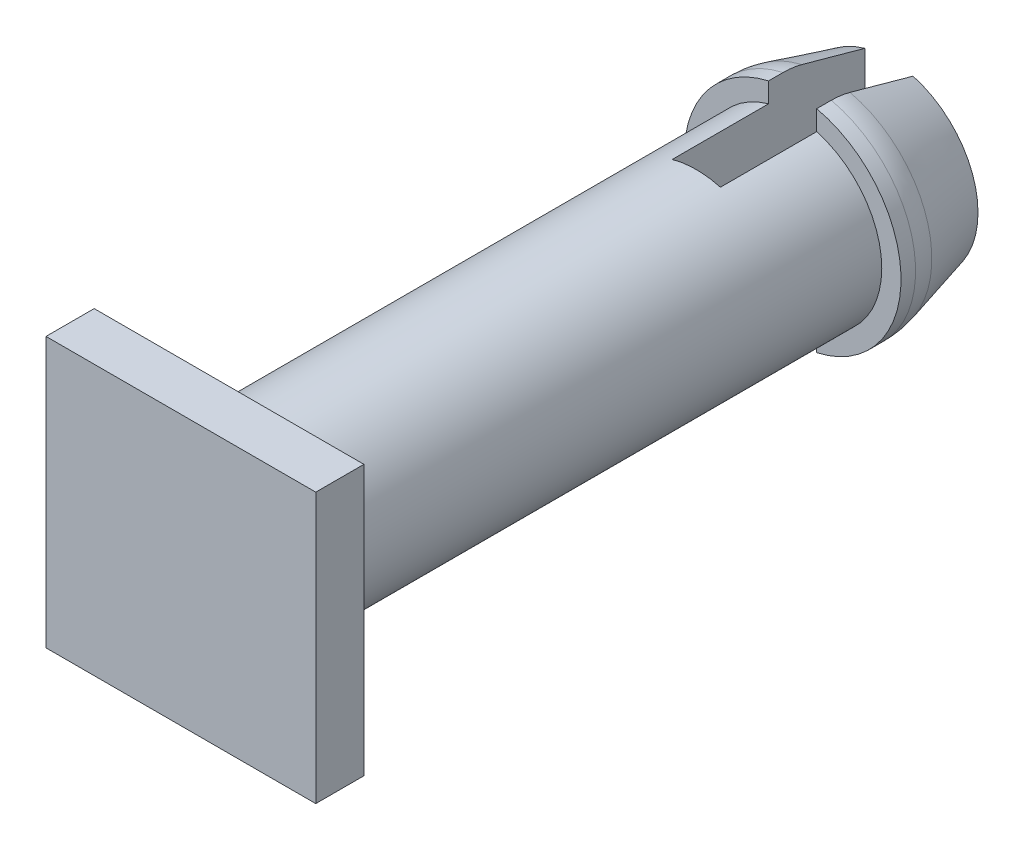
ISO-10303-21;
HEADER;
FILE_DESCRIPTION(('STEP AP214'),'2;1');
FILE_NAME('part.step','',(''),(''),'','','');
FILE_SCHEMA(('AUTOMOTIVE_DESIGN { 1 0 10303 214 1 1 1 1 }'));
ENDSEC;
DATA;
#1=APPLICATION_CONTEXT('core data for automotive mechanical design processes');
#2=APPLICATION_PROTOCOL_DEFINITION('international standard','automotive_design',2000,#1);
#3=PRODUCT_CONTEXT('',#1,'mechanical');
#4=PRODUCT('Part','Part','',(#3));
#5=PRODUCT_RELATED_PRODUCT_CATEGORY('part','',(#4));
#6=PRODUCT_DEFINITION_FORMATION('','',#4);
#7=PRODUCT_DEFINITION_CONTEXT('part definition',#1,'design');
#8=PRODUCT_DEFINITION('design','',#6,#7);
#9=PRODUCT_DEFINITION_SHAPE('','',#8);
#10=(LENGTH_UNIT() NAMED_UNIT(*) SI_UNIT(.MILLI.,.METRE.));
#11=(NAMED_UNIT(*) PLANE_ANGLE_UNIT() SI_UNIT($,.RADIAN.));
#12=(NAMED_UNIT(*) SI_UNIT($,.STERADIAN.) SOLID_ANGLE_UNIT());
#13=UNCERTAINTY_MEASURE_WITH_UNIT(LENGTH_MEASURE(1.E-05),#10,'distance_accuracy_value','');
#14=(GEOMETRIC_REPRESENTATION_CONTEXT(3) GLOBAL_UNCERTAINTY_ASSIGNED_CONTEXT((#13)) GLOBAL_UNIT_ASSIGNED_CONTEXT((#10,
#11,#12)) REPRESENTATION_CONTEXT('',''));
#15=CARTESIAN_POINT('',(0.,0.,0.));
#16=DIRECTION('',(0.,0.,1.));
#17=DIRECTION('',(1.,0.,0.));
#18=AXIS2_PLACEMENT_3D('',#15,#16,#17);
#19=CARTESIAN_POINT('',(0.,0.,-13.7));
#20=DIRECTION('',(0.,0.,-1.));
#21=DIRECTION('',(-1.,0.,0.));
#22=AXIS2_PLACEMENT_3D('',#19,#20,#21);
#23=PLANE('',#22);
#24=DIRECTION('',(0.,-1.,0.));
#25=VECTOR('',#24,1.);
#26=CARTESIAN_POINT('',(0.5,-2.64344159823514,-13.7));
#27=LINE('',#26,#25);
#28=CARTESIAN_POINT('',(0.5,1.77915308025196,-13.7));
#29=VERTEX_POINT('',#28);
#30=CARTESIAN_POINT('',(0.5,0.33166247903554,-13.7));
#31=VERTEX_POINT('',#30);
#32=EDGE_CURVE('E176',#29,#31,#27,.T.);
#33=ORIENTED_EDGE('',*,*,#32,.F.);
#34=CARTESIAN_POINT('',(0.,0.,-13.7));
#35=DIRECTION('',(0.,0.,-1.));
#36=DIRECTION('',(-1.,0.,0.));
#37=AXIS2_PLACEMENT_3D('',#34,#35,#36);
#38=CIRCLE('',#37,1.84807621135331);
#39=CARTESIAN_POINT('',(0.5,-1.77915308025196,-13.7));
#40=VERTEX_POINT('',#39);
#41=EDGE_CURVE('E189',#29,#40,#38,.T.);
#42=ORIENTED_EDGE('',*,*,#41,.T.);
#43=CARTESIAN_POINT('',(0.5,-0.33166247903554,-13.7));
#44=VERTEX_POINT('',#43);
#45=EDGE_CURVE('E193',#44,#40,#27,.T.);
#46=ORIENTED_EDGE('',*,*,#45,.F.);
#47=CARTESIAN_POINT('',(0.,0.,-13.7));
#48=DIRECTION('',(0.,0.,-1.));
#49=DIRECTION('',(-1.,0.,0.));
#50=AXIS2_PLACEMENT_3D('',#47,#48,#49);
#51=CIRCLE('',#50,0.6);
#52=EDGE_CURVE('E191',#31,#44,#51,.T.);
#53=ORIENTED_EDGE('',*,*,#52,.F.);
#54=EDGE_LOOP('',(#33,#42,#46,#53));
#55=FACE_BOUND('',#54,.T.);
#56=ADVANCED_FACE('F32',(#55),#23,.T.);
#57=CARTESIAN_POINT('',(0.,0.,-11.7));
#58=DIRECTION('',(0.,0.,-1.));
#59=DIRECTION('',(-1.,0.,0.));
#60=AXIS2_PLACEMENT_3D('',#57,#58,#59);
#61=PLANE('',#60);
#62=CARTESIAN_POINT('',(0.,0.,-11.7));
#63=DIRECTION('',(0.,0.,-1.));
#64=DIRECTION('',(-1.,0.,0.));
#65=AXIS2_PLACEMENT_3D('',#62,#63,#64);
#66=CIRCLE('',#65,2.25);
#67=CARTESIAN_POINT('',(0.5,2.19374109684803,-11.7));
#68=VERTEX_POINT('',#67);
#69=CARTESIAN_POINT('',(0.5,-2.19374109684803,-11.7));
#70=VERTEX_POINT('',#69);
#71=EDGE_CURVE('E309',#68,#70,#66,.T.);
#72=ORIENTED_EDGE('',*,*,#71,.F.);
#73=DIRECTION('',(0.,-1.,0.));
#74=VECTOR('',#73,1.);
#75=CARTESIAN_POINT('',(0.5,0.,-11.7));
#76=LINE('',#75,#74);
#77=CARTESIAN_POINT('',(0.5,1.78115131305569,-11.7));
#78=VERTEX_POINT('',#77);
#79=EDGE_CURVE('E278',#68,#78,#76,.T.);
#80=ORIENTED_EDGE('',*,*,#79,.T.);
#81=CARTESIAN_POINT('',(0.,0.,-11.7));
#82=DIRECTION('',(0.,0.,-1.));
#83=DIRECTION('',(-1.,0.,0.));
#84=AXIS2_PLACEMENT_3D('',#81,#82,#83);
#85=CIRCLE('',#84,1.85);
#86=CARTESIAN_POINT('',(0.5,-1.78115131305569,-11.7));
#87=VERTEX_POINT('',#86);
#88=EDGE_CURVE('E313',#87,#78,#85,.F.);
#89=ORIENTED_EDGE('',*,*,#88,.F.);
#90=EDGE_CURVE('E284',#87,#70,#76,.T.);
#91=ORIENTED_EDGE('',*,*,#90,.T.);
#92=EDGE_LOOP('',(#72,#80,#89,#91));
#93=FACE_BOUND('',#92,.T.);
#94=ADVANCED_FACE('F379',(#93),#61,.F.);
#95=CARTESIAN_POINT('',(0.,0.,-13.7));
#96=DIRECTION('',(0.,0.,1.));
#97=DIRECTION('',(1.,0.,0.));
#98=AXIS2_PLACEMENT_3D('',#95,#96,#97);
#99=CYLINDRICAL_SURFACE('',#98,2.25);
#100=DIRECTION('',(0.,0.,1.));
#101=VECTOR('',#100,1.);
#102=CARTESIAN_POINT('',(0.5,-2.19374109684803,-13.7));
#103=LINE('',#102,#101);
#104=CARTESIAN_POINT('',(0.5,-2.19374109684803,-12.0025212536189));
#105=VERTEX_POINT('',#104);
#106=EDGE_CURVE('E276',#70,#105,#103,.F.);
#107=ORIENTED_EDGE('',*,*,#106,.T.);
#108=CARTESIAN_POINT('',(0.,0.,-12.0025212536189));
#109=DIRECTION('',(0.,0.,-1.));
#110=DIRECTION('',(-1.,0.,0.));
#111=AXIS2_PLACEMENT_3D('',#108,#109,#110);
#112=CIRCLE('',#111,2.25);
#113=CARTESIAN_POINT('',(0.5,2.19374109684803,-12.0025212536189));
#114=VERTEX_POINT('',#113);
#115=EDGE_CURVE('E255',#105,#114,#112,.F.);
#116=ORIENTED_EDGE('',*,*,#115,.T.);
#117=DIRECTION('',(0.,0.,1.));
#118=VECTOR('',#117,1.);
#119=CARTESIAN_POINT('',(0.5,2.19374109684803,-13.7));
#120=LINE('',#119,#118);
#121=EDGE_CURVE('E274',#114,#68,#120,.T.);
#122=ORIENTED_EDGE('',*,*,#121,.T.);
#123=ORIENTED_EDGE('',*,*,#71,.T.);
#124=EDGE_LOOP('',(#107,#116,#122,#123));
#125=FACE_BOUND('',#124,.T.);
#126=ADVANCED_FACE('F272',(#125),#99,.T.);
#127=CARTESIAN_POINT('',(0.,0.,-13.7));
#128=DIRECTION('',(0.,0.,1.));
#129=DIRECTION('',(1.,0.,0.));
#130=AXIS2_PLACEMENT_3D('',#127,#128,#129);
#131=CONICAL_SURFACE('',#130,1.84807621135331,0.261799387799147);
#132=CARTESIAN_POINT('',(0.5,2.68310947778136,-10.4112294291725));
#133=CARTESIAN_POINT('',(0.5,2.61573901862016,-10.6584022854342));
#134=CARTESIAN_POINT('',(0.5,2.54829120453302,-10.9055540069983));
#135=CARTESIAN_POINT('',(0.5,2.41319371484635,-11.3998025978159));
#136=CARTESIAN_POINT('',(0.5,2.34554403899517,-11.6468994670005));
#137=CARTESIAN_POINT('',(0.5,2.14222491092982,-12.3880764499368));
#138=CARTESIAN_POINT('',(0.5,2.00618221392779,-12.8820544923279));
#139=CARTESIAN_POINT('',(0.5,1.80075669206068,-13.6226520648637));
#140=CARTESIAN_POINT('',(0.5,1.73205357660636,-13.8694599972735));
#141=CARTESIAN_POINT('',(0.5,1.59399408731313,-14.3628919356285));
#142=CARTESIAN_POINT('',(0.5,1.52463771666911,-14.6095159424668));
#143=CARTESIAN_POINT('',(0.5,1.38496271980328,-15.102498891586));
#144=CARTESIAN_POINT('',(0.5,1.31464406936458,-15.3488578270271));
#145=CARTESIAN_POINT('',(0.5,1.20801682084292,-15.7180669085807));
#146=CARTESIAN_POINT('',(0.5,1.17228256471222,-15.8410827118683));
#147=CARTESIAN_POINT('',(0.5,1.10029819822897,-16.0869640504111));
#148=CARTESIAN_POINT('',(0.5,1.06404808457415,-16.209829584699));
#149=CARTESIAN_POINT('',(0.5,1.02747379822656,-16.3325992836863));
#150=B_SPLINE_CURVE_WITH_KNOTS('',3,(#132,#133,#134,#135,#136,#137,#138,#139,#140,#141,#142,
#143,#144,#145,#146,#147,#148,#149),.UNSPECIFIED.,.F.,.F.,(4,2,2,2,2,2,2,2,4),(0.,
0.768569187561272,1.53713933364492,3.07424370539705,3.84281868329404,4.61138990425608,
5.37998050291097,5.76428203596207,6.1485860302313),.UNSPECIFIED.);
#151=CARTESIAN_POINT('',(0.5,2.14128739042845,-12.3907498212727));
#152=VERTEX_POINT('',#151);
#153=EDGE_CURVE('E172',#152,#29,#150,.T.);
#154=ORIENTED_EDGE('',*,*,#153,.F.);
#155=CARTESIAN_POINT('',(0.,0.,-12.3907498212727));
#156=DIRECTION('',(0.,0.,1.));
#157=DIRECTION('',(1.,0.,0.));
#158=AXIS2_PLACEMENT_3D('',#155,#156,#157);
#159=CIRCLE('',#158,2.1988887394336);
#160=CARTESIAN_POINT('',(0.5,-2.14128739042847,-12.3907498212726));
#161=VERTEX_POINT('',#160);
#162=EDGE_CURVE('E244',#152,#161,#159,.F.);
#163=ORIENTED_EDGE('',*,*,#162,.T.);
#164=CARTESIAN_POINT('',(0.5,-1.02747379822656,-16.3325992836863));
#165=CARTESIAN_POINT('',(0.5,-1.07066369732428,-16.1875953403458));
#166=CARTESIAN_POINT('',(0.5,-1.11341229811123,-16.0424611379748));
#167=CARTESIAN_POINT('',(0.5,-1.19822297700708,-15.7519934102126));
#168=CARTESIAN_POINT('',(0.5,-1.24028506075863,-15.6066598864704));
#169=CARTESIAN_POINT('',(0.5,-1.32391864337396,-15.3158552450658));
#170=CARTESIAN_POINT('',(0.5,-1.36549015207567,-15.170384130226));
#171=CARTESIAN_POINT('',(0.5,-1.44825584254114,-14.8793343057072));
#172=CARTESIAN_POINT('',(0.5,-1.48945002348095,-14.7337555957939));
#173=CARTESIAN_POINT('',(0.5,-1.58741909530588,-14.3862078265715));
#174=CARTESIAN_POINT('',(0.5,-1.64405933719465,-14.1842008322944));
#175=CARTESIAN_POINT('',(0.5,-1.75692815365878,-13.7800703916103));
#176=CARTESIAN_POINT('',(0.5,-1.81315672521137,-13.5779469443599));
#177=CARTESIAN_POINT('',(0.5,-2.00618570284141,-12.8820435578582));
#178=CARTESIAN_POINT('',(0.5,-2.14223111431006,-12.3880542614155));
#179=CARTESIAN_POINT('',(0.5,-2.3455516091372,-11.6468716600612));
#180=CARTESIAN_POINT('',(0.5,-2.41319977645981,-11.3997803555807));
#181=CARTESIAN_POINT('',(0.5,-2.54829425934912,-10.9055428969499));
#182=CARTESIAN_POINT('',(0.5,-2.61574057516743,-10.6583967428683));
#183=CARTESIAN_POINT('',(0.5,-2.68310947778136,-10.4112294291725));
#184=B_SPLINE_CURVE_WITH_KNOTS('',3,(#164,#165,#166,#167,#168,#169,#170,#171,#172,#173,#174,
#175,#176,#177,#178,#179,#180,#181,#182,#183),.UNSPECIFIED.,.F.,.F.,(4,2,2,2,2,2,2,2,2,4),(0.,
0.453895904983383,0.907788077404189,1.36167113201061,1.81555517749334,2.44494669826833,
3.07434283586032,4.61148178341834,5.38003464154219,6.14858654123284),.UNSPECIFIED.);
#185=EDGE_CURVE('E182',#40,#161,#184,.T.);
#186=ORIENTED_EDGE('',*,*,#185,.F.);
#187=ORIENTED_EDGE('',*,*,#41,.F.);
#188=EDGE_LOOP('',(#154,#163,#186,#187));
#189=FACE_BOUND('',#188,.T.);
#190=ADVANCED_FACE('F196',(#189),#131,.T.);
#191=CARTESIAN_POINT('',(-2.8,2.8,1.));
#192=DIRECTION('',(0.,1.,0.));
#193=DIRECTION('',(0.,0.,1.));
#194=AXIS2_PLACEMENT_3D('',#191,#192,#193);
#195=PLANE('',#194);
#196=DIRECTION('',(1.,0.,0.));
#197=VECTOR('',#196,1.);
#198=CARTESIAN_POINT('',(-2.8,2.8,0.));
#199=LINE('',#198,#197);
#200=CARTESIAN_POINT('',(-2.8,2.8,0.));
#201=VERTEX_POINT('',#200);
#202=CARTESIAN_POINT('',(2.8,2.8,0.));
#203=VERTEX_POINT('',#202);
#204=EDGE_CURVE('E317',#201,#203,#199,.T.);
#205=ORIENTED_EDGE('',*,*,#204,.F.);
#206=DIRECTION('',(0.,0.,-1.));
#207=VECTOR('',#206,1.);
#208=CARTESIAN_POINT('',(-2.8,2.8,1.));
#209=LINE('',#208,#207);
#210=CARTESIAN_POINT('',(-2.8,2.8,1.));
#211=VERTEX_POINT('',#210);
#212=EDGE_CURVE('E339',#211,#201,#209,.T.);
#213=ORIENTED_EDGE('',*,*,#212,.F.);
#214=DIRECTION('',(1.,0.,0.));
#215=VECTOR('',#214,1.);
#216=CARTESIAN_POINT('',(-2.8,2.8,1.));
#217=LINE('',#216,#215);
#218=CARTESIAN_POINT('',(2.8,2.8,1.));
#219=VERTEX_POINT('',#218);
#220=EDGE_CURVE('E318',#211,#219,#217,.T.);
#221=ORIENTED_EDGE('',*,*,#220,.T.);
#222=DIRECTION('',(0.,0.,-1.));
#223=VECTOR('',#222,1.);
#224=CARTESIAN_POINT('',(2.8,2.8,1.));
#225=LINE('',#224,#223);
#226=EDGE_CURVE('E329',#219,#203,#225,.T.);
#227=ORIENTED_EDGE('',*,*,#226,.T.);
#228=EDGE_LOOP('',(#205,#213,#221,#227));
#229=FACE_BOUND('',#228,.T.);
#230=ADVANCED_FACE('F348',(#229),#195,.T.);
#231=CARTESIAN_POINT('',(-2.8,2.8,1.));
#232=DIRECTION('',(1.,0.,0.));
#233=DIRECTION('',(0.,1.,0.));
#234=AXIS2_PLACEMENT_3D('',#231,#232,#233);
#235=PLANE('',#234);
#236=DIRECTION('',(0.,-1.,0.));
#237=VECTOR('',#236,1.);
#238=CARTESIAN_POINT('',(-2.8,2.8,0.));
#239=LINE('',#238,#237);
#240=CARTESIAN_POINT('',(-2.8,-2.8,0.));
#241=VERTEX_POINT('',#240);
#242=EDGE_CURVE('E322',#201,#241,#239,.T.);
#243=ORIENTED_EDGE('',*,*,#242,.T.);
#244=DIRECTION('',(0.,0.,-1.));
#245=VECTOR('',#244,1.);
#246=CARTESIAN_POINT('',(-2.8,-2.8,1.));
#247=LINE('',#246,#245);
#248=CARTESIAN_POINT('',(-2.8,-2.8,1.));
#249=VERTEX_POINT('',#248);
#250=EDGE_CURVE('E341',#249,#241,#247,.T.);
#251=ORIENTED_EDGE('',*,*,#250,.F.);
#252=DIRECTION('',(0.,-1.,0.));
#253=VECTOR('',#252,1.);
#254=CARTESIAN_POINT('',(-2.8,2.8,1.));
#255=LINE('',#254,#253);
#256=EDGE_CURVE('E327',#211,#249,#255,.T.);
#257=ORIENTED_EDGE('',*,*,#256,.F.);
#258=ORIENTED_EDGE('',*,*,#212,.T.);
#259=EDGE_LOOP('',(#243,#251,#257,#258));
#260=FACE_BOUND('',#259,.T.);
#261=ADVANCED_FACE('F360',(#260),#235,.F.);
#262=CARTESIAN_POINT('',(-2.8,-2.8,1.));
#263=DIRECTION('',(0.,1.,0.));
#264=DIRECTION('',(0.,0.,1.));
#265=AXIS2_PLACEMENT_3D('',#262,#263,#264);
#266=PLANE('',#265);
#267=DIRECTION('',(1.,0.,0.));
#268=VECTOR('',#267,1.);
#269=CARTESIAN_POINT('',(-2.8,-2.8,0.));
#270=LINE('',#269,#268);
#271=CARTESIAN_POINT('',(2.8,-2.8,0.));
#272=VERTEX_POINT('',#271);
#273=EDGE_CURVE('E335',#241,#272,#270,.T.);
#274=ORIENTED_EDGE('',*,*,#273,.T.);
#275=DIRECTION('',(0.,0.,-1.));
#276=VECTOR('',#275,1.);
#277=CARTESIAN_POINT('',(2.8,-2.8,1.));
#278=LINE('',#277,#276);
#279=CARTESIAN_POINT('',(2.8,-2.8,1.));
#280=VERTEX_POINT('',#279);
#281=EDGE_CURVE('E344',#280,#272,#278,.T.);
#282=ORIENTED_EDGE('',*,*,#281,.F.);
#283=DIRECTION('',(1.,0.,0.));
#284=VECTOR('',#283,1.);
#285=CARTESIAN_POINT('',(-2.8,-2.8,1.));
#286=LINE('',#285,#284);
#287=EDGE_CURVE('E325',#249,#280,#286,.T.);
#288=ORIENTED_EDGE('',*,*,#287,.F.);
#289=ORIENTED_EDGE('',*,*,#250,.T.);
#290=EDGE_LOOP('',(#274,#282,#288,#289));
#291=FACE_BOUND('',#290,.T.);
#292=ADVANCED_FACE('F364',(#291),#266,.F.);
#293=CARTESIAN_POINT('',(2.8,2.8,1.));
#294=DIRECTION('',(1.,0.,0.));
#295=DIRECTION('',(0.,1.,0.));
#296=AXIS2_PLACEMENT_3D('',#293,#294,#295);
#297=PLANE('',#296);
#298=DIRECTION('',(0.,-1.,0.));
#299=VECTOR('',#298,1.);
#300=CARTESIAN_POINT('',(2.8,2.8,0.));
#301=LINE('',#300,#299);
#302=EDGE_CURVE('E332',#203,#272,#301,.T.);
#303=ORIENTED_EDGE('',*,*,#302,.F.);
#304=ORIENTED_EDGE('',*,*,#226,.F.);
#305=DIRECTION('',(0.,-1.,0.));
#306=VECTOR('',#305,1.);
#307=CARTESIAN_POINT('',(2.8,2.8,1.));
#308=LINE('',#307,#306);
#309=EDGE_CURVE('E321',#219,#280,#308,.T.);
#310=ORIENTED_EDGE('',*,*,#309,.T.);
#311=ORIENTED_EDGE('',*,*,#281,.T.);
#312=EDGE_LOOP('',(#303,#304,#310,#311));
#313=FACE_BOUND('',#312,.T.);
#314=ADVANCED_FACE('F352',(#313),#297,.T.);
#315=CARTESIAN_POINT('',(0.,0.,1.));
#316=DIRECTION('',(0.,0.,-1.));
#317=DIRECTION('',(-1.,0.,0.));
#318=AXIS2_PLACEMENT_3D('',#315,#316,#317);
#319=PLANE('',#318);
#320=ORIENTED_EDGE('',*,*,#220,.F.);
#321=ORIENTED_EDGE('',*,*,#256,.T.);
#322=ORIENTED_EDGE('',*,*,#287,.T.);
#323=ORIENTED_EDGE('',*,*,#309,.F.);
#324=EDGE_LOOP('',(#320,#321,#322,#323));
#325=FACE_BOUND('',#324,.T.);
#326=ADVANCED_FACE('F366',(#325),#319,.F.);
#327=CARTESIAN_POINT('',(0.,0.,0.));
#328=DIRECTION('',(0.,0.,-1.));
#329=DIRECTION('',(-1.,0.,0.));
#330=AXIS2_PLACEMENT_3D('',#327,#328,#329);
#331=PLANE('',#330);
#332=CARTESIAN_POINT('',(0.,0.,0.));
#333=DIRECTION('',(0.,0.,-1.));
#334=DIRECTION('',(-1.,0.,0.));
#335=AXIS2_PLACEMENT_3D('',#332,#333,#334);
#336=CIRCLE('',#335,1.85);
#337=CARTESIAN_POINT('',(-1.85,0.,0.));
#338=VERTEX_POINT('',#337);
#339=EDGE_CURVE('E203',#338,#338,#336,.T.);
#340=ORIENTED_EDGE('',*,*,#339,.F.);
#341=EDGE_LOOP('',(#340));
#342=FACE_BOUND('',#341,.T.);
#343=ORIENTED_EDGE('',*,*,#204,.T.);
#344=ORIENTED_EDGE('',*,*,#302,.T.);
#345=ORIENTED_EDGE('',*,*,#273,.F.);
#346=ORIENTED_EDGE('',*,*,#242,.F.);
#347=EDGE_LOOP('',(#343,#344,#345,#346));
#348=FACE_BOUND('',#347,.T.);
#349=ADVANCED_FACE('F357',(#342,#348),#331,.T.);
#350=CARTESIAN_POINT('',(0.,0.,-11.7));
#351=DIRECTION('',(0.,0.,1.));
#352=DIRECTION('',(1.,0.,0.));
#353=AXIS2_PLACEMENT_3D('',#350,#351,#352);
#354=CYLINDRICAL_SURFACE('',#353,1.85);
#355=DIRECTION('',(0.,0.,1.));
#356=VECTOR('',#355,1.);
#357=CARTESIAN_POINT('',(0.5,-1.78115131305569,-11.7));
#358=LINE('',#357,#356);
#359=CARTESIAN_POINT('',(0.5,-1.78115131305569,-9.7));
#360=VERTEX_POINT('',#359);
#361=EDGE_CURVE('E292',#87,#360,#358,.T.);
#362=ORIENTED_EDGE('',*,*,#361,.F.);
#363=ORIENTED_EDGE('',*,*,#88,.T.);
#364=DIRECTION('',(0.,0.,1.));
#365=VECTOR('',#364,1.);
#366=CARTESIAN_POINT('',(0.5,1.78115131305569,-11.7));
#367=LINE('',#366,#365);
#368=CARTESIAN_POINT('',(0.5,1.78115131305569,-9.7));
#369=VERTEX_POINT('',#368);
#370=EDGE_CURVE('E282',#369,#78,#367,.F.);
#371=ORIENTED_EDGE('',*,*,#370,.F.);
#372=CARTESIAN_POINT('',(0.,0.,-9.7));
#373=DIRECTION('',(0.,0.,-1.));
#374=DIRECTION('',(-1.,0.,0.));
#375=AXIS2_PLACEMENT_3D('',#372,#373,#374);
#376=CIRCLE('',#375,1.85);
#377=CARTESIAN_POINT('',(-0.5,1.78115131305569,-9.7));
#378=VERTEX_POINT('',#377);
#379=EDGE_CURVE('E299',#369,#378,#376,.F.);
#380=ORIENTED_EDGE('',*,*,#379,.T.);
#381=DIRECTION('',(0.,0.,1.));
#382=VECTOR('',#381,1.);
#383=CARTESIAN_POINT('',(-0.5,1.78115131305569,-11.7));
#384=LINE('',#383,#382);
#385=CARTESIAN_POINT('',(-0.5,1.78115131305569,-11.7));
#386=VERTEX_POINT('',#385);
#387=EDGE_CURVE('E415',#386,#378,#384,.T.);
#388=ORIENTED_EDGE('',*,*,#387,.F.);
#389=CARTESIAN_POINT('',(-0.5,-1.78115131305569,-11.7));
#390=VERTEX_POINT('',#389);
#391=EDGE_CURVE('E310',#386,#390,#85,.F.);
#392=ORIENTED_EDGE('',*,*,#391,.T.);
#393=DIRECTION('',(0.,0.,1.));
#394=VECTOR('',#393,1.);
#395=CARTESIAN_POINT('',(-0.5,-1.78115131305569,-11.7));
#396=LINE('',#395,#394);
#397=CARTESIAN_POINT('',(-0.5,-1.78115131305569,-9.7));
#398=VERTEX_POINT('',#397);
#399=EDGE_CURVE('E417',#398,#390,#396,.F.);
#400=ORIENTED_EDGE('',*,*,#399,.F.);
#401=EDGE_CURVE('E302',#398,#360,#376,.F.);
#402=ORIENTED_EDGE('',*,*,#401,.T.);
#403=EDGE_LOOP('',(#362,#363,#371,#380,#388,#392,#400,#402));
#404=FACE_BOUND('',#403,.T.);
#405=ORIENTED_EDGE('',*,*,#339,.T.);
#406=EDGE_LOOP('',(#405));
#407=FACE_BOUND('',#406,.T.);
#408=ADVANCED_FACE('F373',(#404,#407),#354,.T.);
#409=DIRECTION('',(0.,1.,0.));
#410=VECTOR('',#409,1.);
#411=CARTESIAN_POINT('',(-0.5,-2.64344159823514,-13.7));
#412=LINE('',#411,#410);
#413=CARTESIAN_POINT('',(-0.5,-1.77915308025196,-13.7));
#414=VERTEX_POINT('',#413);
#415=CARTESIAN_POINT('',(-0.5,-0.33166247903554,-13.7));
#416=VERTEX_POINT('',#415);
#417=EDGE_CURVE('E398',#414,#416,#412,.T.);
#418=ORIENTED_EDGE('',*,*,#417,.F.);
#419=CARTESIAN_POINT('',(-0.5,1.77915308025196,-13.7));
#420=VERTEX_POINT('',#419);
#421=EDGE_CURVE('E199',#414,#420,#38,.T.);
#422=ORIENTED_EDGE('',*,*,#421,.T.);
#423=CARTESIAN_POINT('',(-0.5,0.33166247903554,-13.7));
#424=VERTEX_POINT('',#423);
#425=EDGE_CURVE('E192',#424,#420,#412,.T.);
#426=ORIENTED_EDGE('',*,*,#425,.F.);
#427=EDGE_CURVE('E303',#416,#424,#51,.T.);
#428=ORIENTED_EDGE('',*,*,#427,.F.);
#429=EDGE_LOOP('',(#418,#422,#426,#428));
#430=FACE_BOUND('',#429,.T.);
#431=ADVANCED_FACE('F380',(#430),#23,.T.);
#432=CARTESIAN_POINT('',(-0.5,-2.19374109684803,-11.7));
#433=VERTEX_POINT('',#432);
#434=CARTESIAN_POINT('',(-0.5,2.19374109684803,-11.7));
#435=VERTEX_POINT('',#434);
#436=EDGE_CURVE('E306',#433,#435,#66,.T.);
#437=ORIENTED_EDGE('',*,*,#436,.F.);
#438=DIRECTION('',(0.,1.,0.));
#439=VECTOR('',#438,1.);
#440=CARTESIAN_POINT('',(-0.5,0.,-11.7));
#441=LINE('',#440,#439);
#442=EDGE_CURVE('E413',#433,#390,#441,.T.);
#443=ORIENTED_EDGE('',*,*,#442,.T.);
#444=ORIENTED_EDGE('',*,*,#391,.F.);
#445=EDGE_CURVE('E419',#386,#435,#441,.T.);
#446=ORIENTED_EDGE('',*,*,#445,.T.);
#447=EDGE_LOOP('',(#437,#443,#444,#446));
#448=FACE_BOUND('',#447,.T.);
#449=ADVANCED_FACE('F386',(#448),#61,.F.);
#450=DIRECTION('',(0.,0.,1.));
#451=VECTOR('',#450,1.);
#452=CARTESIAN_POINT('',(-0.5,2.19374109684803,-13.7));
#453=LINE('',#452,#451);
#454=CARTESIAN_POINT('',(-0.5,2.19374109684803,-12.0025212536189));
#455=VERTEX_POINT('',#454);
#456=EDGE_CURVE('E411',#435,#455,#453,.F.);
#457=ORIENTED_EDGE('',*,*,#456,.T.);
#458=CARTESIAN_POINT('',(0.,0.,-12.0025212536189));
#459=DIRECTION('',(0.,0.,-1.));
#460=DIRECTION('',(-1.,0.,0.));
#461=AXIS2_PLACEMENT_3D('',#458,#459,#460);
#462=CIRCLE('',#461,2.25);
#463=CARTESIAN_POINT('',(-0.5,-2.19374109684803,-12.0025212536189));
#464=VERTEX_POINT('',#463);
#465=EDGE_CURVE('E236',#455,#464,#462,.F.);
#466=ORIENTED_EDGE('',*,*,#465,.T.);
#467=DIRECTION('',(0.,0.,1.));
#468=VECTOR('',#467,1.);
#469=CARTESIAN_POINT('',(-0.5,-2.19374109684803,-13.7));
#470=LINE('',#469,#468);
#471=EDGE_CURVE('E409',#464,#433,#470,.T.);
#472=ORIENTED_EDGE('',*,*,#471,.T.);
#473=ORIENTED_EDGE('',*,*,#436,.T.);
#474=EDGE_LOOP('',(#457,#466,#472,#473));
#475=FACE_BOUND('',#474,.T.);
#476=ADVANCED_FACE('F393',(#475),#99,.T.);
#477=CARTESIAN_POINT('',(0.,0.,-6.7));
#478=DIRECTION('',(0.,0.,-1.));
#479=DIRECTION('',(-1.,0.,0.));
#480=AXIS2_PLACEMENT_3D('',#477,#478,#479);
#481=PLANE('',#480);
#482=CARTESIAN_POINT('',(0.,0.,-6.7));
#483=DIRECTION('',(0.,0.,-1.));
#484=DIRECTION('',(-1.,0.,0.));
#485=AXIS2_PLACEMENT_3D('',#482,#483,#484);
#486=CIRCLE('',#485,0.6);
#487=CARTESIAN_POINT('',(-0.6,0.,-6.7));
#488=VERTEX_POINT('',#487);
#489=EDGE_CURVE('E314',#488,#488,#486,.T.);
#490=ORIENTED_EDGE('',*,*,#489,.T.);
#491=EDGE_LOOP('',(#490));
#492=FACE_BOUND('',#491,.T.);
#493=ADVANCED_FACE('F545',(#492),#481,.T.);
#494=CARTESIAN_POINT('',(0.,0.,-6.7));
#495=DIRECTION('',(0.,0.,-1.));
#496=DIRECTION('',(-1.,0.,0.));
#497=AXIS2_PLACEMENT_3D('',#494,#495,#496);
#498=CYLINDRICAL_SURFACE('',#497,0.6);
#499=ORIENTED_EDGE('',*,*,#52,.T.);
#500=DIRECTION('',(0.,0.,-1.));
#501=VECTOR('',#500,1.);
#502=CARTESIAN_POINT('',(0.5,-0.33166247903554,-6.7));
#503=LINE('',#502,#501);
#504=CARTESIAN_POINT('',(0.5,-0.33166247903554,-9.7));
#505=VERTEX_POINT('',#504);
#506=EDGE_CURVE('E296',#44,#505,#503,.F.);
#507=ORIENTED_EDGE('',*,*,#506,.T.);
#508=CARTESIAN_POINT('',(0.,0.,-9.7));
#509=DIRECTION('',(0.,0.,-1.));
#510=DIRECTION('',(-1.,0.,0.));
#511=AXIS2_PLACEMENT_3D('',#508,#509,#510);
#512=CIRCLE('',#511,0.6);
#513=CARTESIAN_POINT('',(-0.5,-0.33166247903554,-9.7));
#514=VERTEX_POINT('',#513);
#515=EDGE_CURVE('E258',#514,#505,#512,.F.);
#516=ORIENTED_EDGE('',*,*,#515,.F.);
#517=DIRECTION('',(0.,0.,-1.));
#518=VECTOR('',#517,1.);
#519=CARTESIAN_POINT('',(-0.5,-0.33166247903554,-6.7));
#520=LINE('',#519,#518);
#521=EDGE_CURVE('E286',#514,#416,#520,.T.);
#522=ORIENTED_EDGE('',*,*,#521,.T.);
#523=ORIENTED_EDGE('',*,*,#427,.T.);
#524=DIRECTION('',(0.,0.,-1.));
#525=VECTOR('',#524,1.);
#526=CARTESIAN_POINT('',(-0.5,0.33166247903554,-6.7));
#527=LINE('',#526,#525);
#528=CARTESIAN_POINT('',(-0.5,0.33166247903554,-9.7));
#529=VERTEX_POINT('',#528);
#530=EDGE_CURVE('E280',#424,#529,#527,.F.);
#531=ORIENTED_EDGE('',*,*,#530,.T.);
#532=CARTESIAN_POINT('',(0.5,0.33166247903554,-9.7));
#533=VERTEX_POINT('',#532);
#534=EDGE_CURVE('E259',#533,#529,#512,.F.);
#535=ORIENTED_EDGE('',*,*,#534,.F.);
#536=DIRECTION('',(0.,0.,-1.));
#537=VECTOR('',#536,1.);
#538=CARTESIAN_POINT('',(0.5,0.33166247903554,-6.7));
#539=LINE('',#538,#537);
#540=EDGE_CURVE('E294',#533,#31,#539,.T.);
#541=ORIENTED_EDGE('',*,*,#540,.T.);
#542=EDGE_LOOP('',(#499,#507,#516,#522,#523,#531,#535,#541));
#543=FACE_BOUND('',#542,.T.);
#544=ORIENTED_EDGE('',*,*,#489,.F.);
#545=EDGE_LOOP('',(#544));
#546=FACE_BOUND('',#545,.T.);
#547=ADVANCED_FACE('F424',(#543,#546),#498,.F.);
#548=CARTESIAN_POINT('',(-0.5,-2.68310947778136,-10.4112294291725));
#549=CARTESIAN_POINT('',(-0.5,-2.61573901862016,-10.6584022854342));
#550=CARTESIAN_POINT('',(-0.5,-2.54829120453302,-10.9055540069983));
#551=CARTESIAN_POINT('',(-0.5,-2.41319371484635,-11.3998025978159));
#552=CARTESIAN_POINT('',(-0.5,-2.34554403899517,-11.6468994670005));
#553=CARTESIAN_POINT('',(-0.5,-2.14222491092982,-12.3880764499368));
#554=CARTESIAN_POINT('',(-0.5,-2.00618221392779,-12.8820544923279));
#555=CARTESIAN_POINT('',(-0.5,-1.80075669206068,-13.6226520648637));
#556=CARTESIAN_POINT('',(-0.5,-1.73205357660636,-13.8694599972735));
#557=CARTESIAN_POINT('',(-0.5,-1.59399408731313,-14.3628919356285));
#558=CARTESIAN_POINT('',(-0.5,-1.52463771666911,-14.6095159424668));
#559=CARTESIAN_POINT('',(-0.5,-1.38496271980328,-15.102498891586));
#560=CARTESIAN_POINT('',(-0.5,-1.31464406936458,-15.3488578270271));
#561=CARTESIAN_POINT('',(-0.5,-1.20801682084292,-15.7180669085807));
#562=CARTESIAN_POINT('',(-0.5,-1.17228256471222,-15.8410827118683));
#563=CARTESIAN_POINT('',(-0.5,-1.10029819822897,-16.0869640504111));
#564=CARTESIAN_POINT('',(-0.5,-1.06404808457415,-16.209829584699));
#565=CARTESIAN_POINT('',(-0.5,-1.02747379822656,-16.3325992836863));
#566=B_SPLINE_CURVE_WITH_KNOTS('',3,(#548,#549,#550,#551,#552,#553,#554,#555,#556,#557,#558,
#559,#560,#561,#562,#563,#564,#565),.UNSPECIFIED.,.F.,.F.,(4,2,2,2,2,2,2,2,4),(0.,
0.768569187561272,1.53713933364492,3.07424370539705,3.84281868329404,4.61138990425608,
5.37998050291097,5.76428203596207,6.1485860302313),.UNSPECIFIED.);
#567=CARTESIAN_POINT('',(-0.5,-2.14128739042845,-12.3907498212727));
#568=VERTEX_POINT('',#567);
#569=EDGE_CURVE('E183',#568,#414,#566,.T.);
#570=ORIENTED_EDGE('',*,*,#569,.F.);
#571=CARTESIAN_POINT('',(0.,0.,-12.3907498212727));
#572=DIRECTION('',(0.,0.,1.));
#573=DIRECTION('',(1.,0.,0.));
#574=AXIS2_PLACEMENT_3D('',#571,#572,#573);
#575=CIRCLE('',#574,2.1988887394336);
#576=CARTESIAN_POINT('',(-0.5,2.14128739042847,-12.3907498212726));
#577=VERTEX_POINT('',#576);
#578=EDGE_CURVE('E45',#568,#577,#575,.F.);
#579=ORIENTED_EDGE('',*,*,#578,.T.);
#580=CARTESIAN_POINT('',(-0.5,1.02747379822656,-16.3325992836863));
#581=CARTESIAN_POINT('',(-0.5,1.07066369732428,-16.1875953403458));
#582=CARTESIAN_POINT('',(-0.5,1.11341229811123,-16.0424611379748));
#583=CARTESIAN_POINT('',(-0.5,1.19822297700708,-15.7519934102126));
#584=CARTESIAN_POINT('',(-0.5,1.24028506075863,-15.6066598864704));
#585=CARTESIAN_POINT('',(-0.5,1.32391864337396,-15.3158552450658));
#586=CARTESIAN_POINT('',(-0.5,1.36549015207567,-15.170384130226));
#587=CARTESIAN_POINT('',(-0.5,1.44825584254114,-14.8793343057072));
#588=CARTESIAN_POINT('',(-0.5,1.48945002348095,-14.7337555957939));
#589=CARTESIAN_POINT('',(-0.5,1.58741909530588,-14.3862078265715));
#590=CARTESIAN_POINT('',(-0.5,1.64405933719465,-14.1842008322944));
#591=CARTESIAN_POINT('',(-0.5,1.75692815365878,-13.7800703916103));
#592=CARTESIAN_POINT('',(-0.5,1.81315672521137,-13.5779469443599));
#593=CARTESIAN_POINT('',(-0.5,2.00618570284141,-12.8820435578582));
#594=CARTESIAN_POINT('',(-0.5,2.14223111431006,-12.3880542614155));
#595=CARTESIAN_POINT('',(-0.5,2.3455516091372,-11.6468716600612));
#596=CARTESIAN_POINT('',(-0.5,2.41319977645981,-11.3997803555807));
#597=CARTESIAN_POINT('',(-0.5,2.54829425934912,-10.9055428969499));
#598=CARTESIAN_POINT('',(-0.5,2.61574057516743,-10.6583967428683));
#599=CARTESIAN_POINT('',(-0.5,2.68310947778136,-10.4112294291725));
#600=B_SPLINE_CURVE_WITH_KNOTS('',3,(#580,#581,#582,#583,#584,#585,#586,#587,#588,#589,#590,
#591,#592,#593,#594,#595,#596,#597,#598,#599),.UNSPECIFIED.,.F.,.F.,(4,2,2,2,2,2,2,2,2,4),(0.,
0.453895904983383,0.907788077404189,1.36167113201061,1.81555517749334,2.44494669826833,
3.07434283586032,4.61148178341834,5.38003464154219,6.14858654123284),.UNSPECIFIED.);
#601=EDGE_CURVE('E198',#420,#577,#600,.T.);
#602=ORIENTED_EDGE('',*,*,#601,.F.);
#603=ORIENTED_EDGE('',*,*,#421,.F.);
#604=EDGE_LOOP('',(#570,#579,#602,#603));
#605=FACE_BOUND('',#604,.T.);
#606=ADVANCED_FACE('F214',(#605),#131,.T.);
#607=CARTESIAN_POINT('',(-0.5,-2.64344159823514,-9.7));
#608=DIRECTION('',(-1.,0.,0.));
#609=DIRECTION('',(0.,0.,1.));
#610=AXIS2_PLACEMENT_3D('',#607,#608,#609);
#611=PLANE('',#610);
#612=ORIENTED_EDGE('',*,*,#601,.T.);
#613=CARTESIAN_POINT('',(-0.49999999999875,2.14128739042875,-12.3907498212727));
#614=CARTESIAN_POINT('',(-0.499999999999375,2.15873044225591,-12.3272206249668));
#615=CARTESIAN_POINT('',(-0.499999999999792,2.17182311037077,-12.2631036466921));
#616=CARTESIAN_POINT('',(-0.500000000000208,2.1893076794498,-12.1336941241777));
#617=CARTESIAN_POINT('',(-0.500000000000208,2.19369958014137,-12.0684015799011));
#618=CARTESIAN_POINT('',(-0.5,2.19374109684803,-12.0025212536189));
#619=B_SPLINE_CURVE_WITH_KNOTS('',3,(#613,#614,#615,#616,#617,#618),.UNSPECIFIED.,.F.,.F.,(4,2,
4),(0.,0.196320258131988,0.392640522414887),.UNSPECIFIED.);
#620=EDGE_CURVE('E11',#577,#455,#619,.T.);
#621=ORIENTED_EDGE('',*,*,#620,.T.);
#622=ORIENTED_EDGE('',*,*,#456,.F.);
#623=ORIENTED_EDGE('',*,*,#445,.F.);
#624=ORIENTED_EDGE('',*,*,#387,.T.);
#625=DIRECTION('',(0.,1.,0.));
#626=VECTOR('',#625,1.);
#627=CARTESIAN_POINT('',(-0.5,-2.64344159823514,-9.7));
#628=LINE('',#627,#626);
#629=EDGE_CURVE('E434',#529,#378,#628,.T.);
#630=ORIENTED_EDGE('',*,*,#629,.F.);
#631=ORIENTED_EDGE('',*,*,#530,.F.);
#632=ORIENTED_EDGE('',*,*,#425,.T.);
#633=EDGE_LOOP('',(#612,#621,#622,#623,#624,#630,#631,#632));
#634=FACE_BOUND('',#633,.T.);
#635=ADVANCED_FACE('F217',(#634),#611,.F.);
#636=CARTESIAN_POINT('',(0.5,-2.64344159823514,-9.7));
#637=DIRECTION('',(1.,0.,0.));
#638=DIRECTION('',(0.,0.,-1.));
#639=AXIS2_PLACEMENT_3D('',#636,#637,#638);
#640=PLANE('',#639);
#641=ORIENTED_EDGE('',*,*,#121,.F.);
#642=CARTESIAN_POINT('',(0.5,2.19374109684803,-12.0025212536189));
#643=CARTESIAN_POINT('',(0.5,2.19369958014141,-12.0684015799012));
#644=CARTESIAN_POINT('',(0.5,2.18930767944985,-12.1336941241777));
#645=CARTESIAN_POINT('',(0.5,2.17182311037072,-12.2631036466921));
#646=CARTESIAN_POINT('',(0.5,2.15873044225576,-12.3272206249668));
#647=CARTESIAN_POINT('',(0.5,2.14128739042845,-12.3907498212727));
#648=B_SPLINE_CURVE_WITH_KNOTS('',3,(#642,#643,#644,#645,#646,#647),.UNSPECIFIED.,.F.,.F.,(4,2,
4),(0.,0.196320264282918,0.392640522414945),.UNSPECIFIED.);
#649=EDGE_CURVE('E178',#114,#152,#648,.T.);
#650=ORIENTED_EDGE('',*,*,#649,.T.);
#651=ORIENTED_EDGE('',*,*,#153,.T.);
#652=ORIENTED_EDGE('',*,*,#32,.T.);
#653=ORIENTED_EDGE('',*,*,#540,.F.);
#654=DIRECTION('',(0.,-1.,0.));
#655=VECTOR('',#654,1.);
#656=CARTESIAN_POINT('',(0.5,-2.64344159823514,-9.7));
#657=LINE('',#656,#655);
#658=EDGE_CURVE('E438',#369,#533,#657,.T.);
#659=ORIENTED_EDGE('',*,*,#658,.F.);
#660=ORIENTED_EDGE('',*,*,#370,.T.);
#661=ORIENTED_EDGE('',*,*,#79,.F.);
#662=EDGE_LOOP('',(#641,#650,#651,#652,#653,#659,#660,#661));
#663=FACE_BOUND('',#662,.T.);
#664=ADVANCED_FACE('F175',(#663),#640,.F.);
#665=CARTESIAN_POINT('',(0.,0.,-9.7));
#666=DIRECTION('',(0.,0.,-1.));
#667=DIRECTION('',(-1.,0.,0.));
#668=AXIS2_PLACEMENT_3D('',#665,#666,#667);
#669=PLANE('',#668);
#670=ORIENTED_EDGE('',*,*,#658,.T.);
#671=ORIENTED_EDGE('',*,*,#534,.T.);
#672=ORIENTED_EDGE('',*,*,#629,.T.);
#673=ORIENTED_EDGE('',*,*,#379,.F.);
#674=EDGE_LOOP('',(#670,#671,#672,#673));
#675=FACE_BOUND('',#674,.T.);
#676=ADVANCED_FACE('F451',(#675),#669,.T.);
#677=EDGE_CURVE('E428',#398,#514,#628,.T.);
#678=ORIENTED_EDGE('',*,*,#677,.T.);
#679=ORIENTED_EDGE('',*,*,#515,.T.);
#680=EDGE_CURVE('E402',#505,#360,#657,.T.);
#681=ORIENTED_EDGE('',*,*,#680,.T.);
#682=ORIENTED_EDGE('',*,*,#401,.F.);
#683=EDGE_LOOP('',(#678,#679,#681,#682));
#684=FACE_BOUND('',#683,.T.);
#685=ADVANCED_FACE('F224',(#684),#669,.T.);
#686=ORIENTED_EDGE('',*,*,#185,.T.);
#687=CARTESIAN_POINT('',(0.49999999999875,-2.14128739042875,-12.3907498212727));
#688=CARTESIAN_POINT('',(0.499999999999375,-2.15873044225591,-12.3272206249668));
#689=CARTESIAN_POINT('',(0.499999999999792,-2.17182311037077,-12.2631036466921));
#690=CARTESIAN_POINT('',(0.500000000000208,-2.1893076794498,-12.1336941241777));
#691=CARTESIAN_POINT('',(0.500000000000208,-2.19369958014137,-12.0684015799011));
#692=CARTESIAN_POINT('',(0.5,-2.19374109684803,-12.0025212536189));
#693=B_SPLINE_CURVE_WITH_KNOTS('',3,(#687,#688,#689,#690,#691,#692),.UNSPECIFIED.,.F.,.F.,(4,2,
4),(0.,0.196320258131988,0.392640522414887),.UNSPECIFIED.);
#694=EDGE_CURVE('E239',#161,#105,#693,.T.);
#695=ORIENTED_EDGE('',*,*,#694,.T.);
#696=ORIENTED_EDGE('',*,*,#106,.F.);
#697=ORIENTED_EDGE('',*,*,#90,.F.);
#698=ORIENTED_EDGE('',*,*,#361,.T.);
#699=ORIENTED_EDGE('',*,*,#680,.F.);
#700=ORIENTED_EDGE('',*,*,#506,.F.);
#701=ORIENTED_EDGE('',*,*,#45,.T.);
#702=EDGE_LOOP('',(#686,#695,#696,#697,#698,#699,#700,#701));
#703=FACE_BOUND('',#702,.T.);
#704=ADVANCED_FACE('F225',(#703),#640,.F.);
#705=ORIENTED_EDGE('',*,*,#471,.F.);
#706=CARTESIAN_POINT('',(-0.5,-2.19374109684803,-12.0025212536189));
#707=CARTESIAN_POINT('',(-0.5,-2.19369958014141,-12.0684015799012));
#708=CARTESIAN_POINT('',(-0.5,-2.18930767944985,-12.1336941241777));
#709=CARTESIAN_POINT('',(-0.5,-2.17182311037072,-12.2631036466921));
#710=CARTESIAN_POINT('',(-0.5,-2.15873044225576,-12.3272206249668));
#711=CARTESIAN_POINT('',(-0.5,-2.14128739042845,-12.3907498212727));
#712=B_SPLINE_CURVE_WITH_KNOTS('',3,(#706,#707,#708,#709,#710,#711),.UNSPECIFIED.,.F.,.F.,(4,2,
4),(0.,0.196320264282918,0.392640522414945),.UNSPECIFIED.);
#713=EDGE_CURVE('E59',#464,#568,#712,.T.);
#714=ORIENTED_EDGE('',*,*,#713,.T.);
#715=ORIENTED_EDGE('',*,*,#569,.T.);
#716=ORIENTED_EDGE('',*,*,#417,.T.);
#717=ORIENTED_EDGE('',*,*,#521,.F.);
#718=ORIENTED_EDGE('',*,*,#677,.F.);
#719=ORIENTED_EDGE('',*,*,#399,.T.);
#720=ORIENTED_EDGE('',*,*,#442,.F.);
#721=EDGE_LOOP('',(#705,#714,#715,#716,#717,#718,#719,#720));
#722=FACE_BOUND('',#721,.T.);
#723=ADVANCED_FACE('F223',(#722),#611,.F.);
#724=CARTESIAN_POINT('',(0.,0.,-12.0025212536189));
#725=DIRECTION('',(0.,0.,-1.));
#726=DIRECTION('',(-1.,0.,0.));
#727=AXIS2_PLACEMENT_3D('',#724,#725,#726);
#728=DEGENERATE_TOROIDAL_SURFACE('',#727,0.75,1.5,.T.);
#729=ORIENTED_EDGE('',*,*,#694,.F.);
#730=ORIENTED_EDGE('',*,*,#162,.F.);
#731=ORIENTED_EDGE('',*,*,#649,.F.);
#732=ORIENTED_EDGE('',*,*,#115,.F.);
#733=EDGE_LOOP('',(#729,#730,#731,#732));
#734=FACE_BOUND('',#733,.T.);
#735=ADVANCED_FACE('F246',(#734),#728,.T.);
#736=CARTESIAN_POINT('',(0.,0.,-12.0025212536189));
#737=DIRECTION('',(0.,0.,-1.));
#738=DIRECTION('',(-1.,0.,0.));
#739=AXIS2_PLACEMENT_3D('',#736,#737,#738);
#740=DEGENERATE_TOROIDAL_SURFACE('',#739,0.75,1.5,.T.);
#741=ORIENTED_EDGE('',*,*,#620,.F.);
#742=ORIENTED_EDGE('',*,*,#578,.F.);
#743=ORIENTED_EDGE('',*,*,#713,.F.);
#744=ORIENTED_EDGE('',*,*,#465,.F.);
#745=EDGE_LOOP('',(#741,#742,#743,#744));
#746=FACE_BOUND('',#745,.T.);
#747=ADVANCED_FACE('F34',(#746),#740,.T.);
#748=CLOSED_SHELL('',(#56,#94,#126,#190,#230,#261,#292,#314,#326,#349,#408,#431,#449,#476,#493,
#547,#606,#635,#664,#676,#685,#704,#723,#735,#747));
#749=MANIFOLD_SOLID_BREP('B2',#748);
#750=ADVANCED_BREP_SHAPE_REPRESENTATION('',(#18,#749),#14);
#751=SHAPE_DEFINITION_REPRESENTATION(#9,#750);
ENDSEC;
END-ISO-10303-21;
